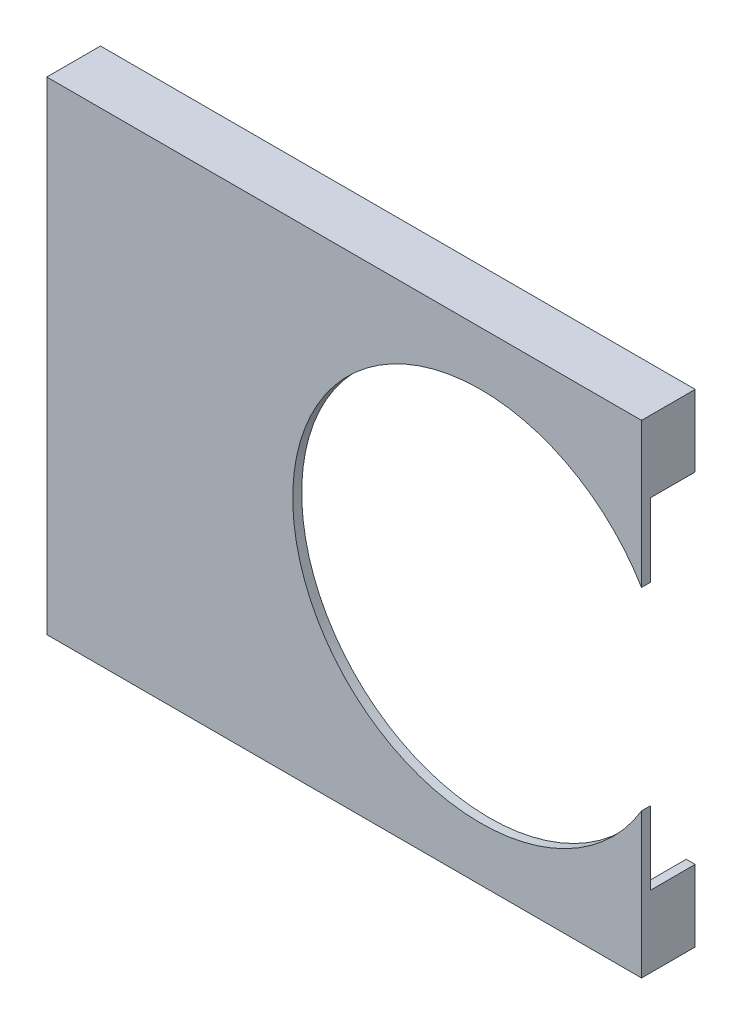
ISO-10303-21;
HEADER;
FILE_DESCRIPTION(('STEP AP214'),'2;1');
FILE_NAME('part.step','',(''),(''),'','','');
FILE_SCHEMA(('AUTOMOTIVE_DESIGN { 1 0 10303 214 1 1 1 1 }'));
ENDSEC;
DATA;
#1=APPLICATION_CONTEXT('core data for automotive mechanical design processes');
#2=APPLICATION_PROTOCOL_DEFINITION('international standard','automotive_design',2000,#1);
#3=PRODUCT_CONTEXT('',#1,'mechanical');
#4=PRODUCT('Part','Part','',(#3));
#5=PRODUCT_RELATED_PRODUCT_CATEGORY('part','',(#4));
#6=PRODUCT_DEFINITION_FORMATION('','',#4);
#7=PRODUCT_DEFINITION_CONTEXT('part definition',#1,'design');
#8=PRODUCT_DEFINITION('design','',#6,#7);
#9=PRODUCT_DEFINITION_SHAPE('','',#8);
#10=(LENGTH_UNIT() NAMED_UNIT(*) SI_UNIT(.MILLI.,.METRE.));
#11=(NAMED_UNIT(*) PLANE_ANGLE_UNIT() SI_UNIT($,.RADIAN.));
#12=(NAMED_UNIT(*) SI_UNIT($,.STERADIAN.) SOLID_ANGLE_UNIT());
#13=UNCERTAINTY_MEASURE_WITH_UNIT(LENGTH_MEASURE(1.E-05),#10,'distance_accuracy_value','');
#14=(GEOMETRIC_REPRESENTATION_CONTEXT(3) GLOBAL_UNCERTAINTY_ASSIGNED_CONTEXT((#13)) GLOBAL_UNIT_ASSIGNED_CONTEXT((#10,
#11,#12)) REPRESENTATION_CONTEXT('',''));
#15=CARTESIAN_POINT('',(0.,0.,0.));
#16=DIRECTION('',(0.,0.,1.));
#17=DIRECTION('',(1.,0.,0.));
#18=AXIS2_PLACEMENT_3D('',#15,#16,#17);
#19=CARTESIAN_POINT('',(15.25,0.,1.));
#20=DIRECTION('',(0.,0.,-1.));
#21=DIRECTION('',(-1.,0.,0.));
#22=AXIS2_PLACEMENT_3D('',#19,#20,#21);
#23=CYLINDRICAL_SURFACE('',#22,21.);
#24=CARTESIAN_POINT('',(15.25,0.,0.));
#25=DIRECTION('',(0.,0.,1.));
#26=DIRECTION('',(1.,0.,0.));
#27=AXIS2_PLACEMENT_3D('',#24,#25,#26);
#28=CIRCLE('',#27,21.);
#29=CARTESIAN_POINT('',(33.25,10.8166538263919,0.));
#30=VERTEX_POINT('',#29);
#31=CARTESIAN_POINT('',(33.25,-10.8166538263919,0.));
#32=VERTEX_POINT('',#31);
#33=EDGE_CURVE('E258',#30,#32,#28,.T.);
#34=ORIENTED_EDGE('',*,*,#33,.F.);
#35=DIRECTION('',(0.,0.,-1.));
#36=VECTOR('',#35,1.);
#37=CARTESIAN_POINT('',(33.25,10.8166538263919,1.));
#38=LINE('',#37,#36);
#39=CARTESIAN_POINT('',(33.25,10.8166538263919,1.));
#40=VERTEX_POINT('',#39);
#41=EDGE_CURVE('E12',#40,#30,#38,.T.);
#42=ORIENTED_EDGE('',*,*,#41,.F.);
#43=CARTESIAN_POINT('',(15.25,0.,1.));
#44=DIRECTION('',(0.,0.,1.));
#45=DIRECTION('',(1.,0.,0.));
#46=AXIS2_PLACEMENT_3D('',#43,#44,#45);
#47=CIRCLE('',#46,21.);
#48=CARTESIAN_POINT('',(33.25,-10.8166538263919,1.));
#49=VERTEX_POINT('',#48);
#50=EDGE_CURVE('E294',#40,#49,#47,.T.);
#51=ORIENTED_EDGE('',*,*,#50,.T.);
#52=DIRECTION('',(0.,0.,-1.));
#53=VECTOR('',#52,1.);
#54=CARTESIAN_POINT('',(33.25,-10.8166538263919,1.));
#55=LINE('',#54,#53);
#56=EDGE_CURVE('E314',#49,#32,#55,.T.);
#57=ORIENTED_EDGE('',*,*,#56,.T.);
#58=EDGE_LOOP('',(#34,#42,#51,#57));
#59=FACE_BOUND('',#58,.T.);
#60=ADVANCED_FACE('F59',(#59),#23,.F.);
#61=CARTESIAN_POINT('',(33.25,0.,1.));
#62=DIRECTION('',(1.,0.,0.));
#63=DIRECTION('',(0.,0.,-1.));
#64=AXIS2_PLACEMENT_3D('',#61,#62,#63);
#65=PLANE('',#64);
#66=DIRECTION('',(0.,-1.,0.));
#67=VECTOR('',#66,1.);
#68=CARTESIAN_POINT('',(33.25,0.,0.));
#69=LINE('',#68,#67);
#70=CARTESIAN_POINT('',(33.25,19.,0.));
#71=VERTEX_POINT('',#70);
#72=EDGE_CURVE('E189',#71,#30,#69,.T.);
#73=ORIENTED_EDGE('',*,*,#72,.F.);
#74=DIRECTION('',(0.,0.,1.));
#75=VECTOR('',#74,1.);
#76=CARTESIAN_POINT('',(33.25,19.,-5.));
#77=LINE('',#76,#75);
#78=CARTESIAN_POINT('',(33.25,19.,-5.));
#79=VERTEX_POINT('',#78);
#80=EDGE_CURVE('E183',#79,#71,#77,.T.);
#81=ORIENTED_EDGE('',*,*,#80,.F.);
#82=DIRECTION('',(0.,1.,0.));
#83=VECTOR('',#82,1.);
#84=CARTESIAN_POINT('',(33.25,0.,-5.));
#85=LINE('',#84,#83);
#86=CARTESIAN_POINT('',(33.25,27.,-5.));
#87=VERTEX_POINT('',#86);
#88=EDGE_CURVE('E187',#79,#87,#85,.T.);
#89=ORIENTED_EDGE('',*,*,#88,.T.);
#90=DIRECTION('',(0.,0.,-1.));
#91=VECTOR('',#90,1.);
#92=CARTESIAN_POINT('',(33.25,27.,1.));
#93=LINE('',#92,#91);
#94=CARTESIAN_POINT('',(33.25,27.,1.));
#95=VERTEX_POINT('',#94);
#96=EDGE_CURVE('E66',#95,#87,#93,.T.);
#97=ORIENTED_EDGE('',*,*,#96,.F.);
#98=DIRECTION('',(0.,-1.,0.));
#99=VECTOR('',#98,1.);
#100=CARTESIAN_POINT('',(33.25,0.,1.));
#101=LINE('',#100,#99);
#102=EDGE_CURVE('E297',#95,#40,#101,.T.);
#103=ORIENTED_EDGE('',*,*,#102,.T.);
#104=ORIENTED_EDGE('',*,*,#41,.T.);
#105=EDGE_LOOP('',(#73,#81,#89,#97,#103,#104));
#106=FACE_BOUND('',#105,.T.);
#107=ADVANCED_FACE('F185',(#106),#65,.T.);
#108=CARTESIAN_POINT('',(0.,27.,1.));
#109=DIRECTION('',(0.,1.,0.));
#110=DIRECTION('',(0.,0.,1.));
#111=AXIS2_PLACEMENT_3D('',#108,#109,#110);
#112=PLANE('',#111);
#113=ORIENTED_EDGE('',*,*,#96,.T.);
#114=DIRECTION('',(-1.,0.,0.));
#115=VECTOR('',#114,1.);
#116=CARTESIAN_POINT('',(0.,27.,-5.));
#117=LINE('',#116,#115);
#118=CARTESIAN_POINT('',(-33.25,27.,-5.));
#119=VERTEX_POINT('',#118);
#120=EDGE_CURVE('E207',#87,#119,#117,.T.);
#121=ORIENTED_EDGE('',*,*,#120,.T.);
#122=DIRECTION('',(0.,0.,-1.));
#123=VECTOR('',#122,1.);
#124=CARTESIAN_POINT('',(-33.25,27.,1.));
#125=LINE('',#124,#123);
#126=CARTESIAN_POINT('',(-33.25,27.,1.));
#127=VERTEX_POINT('',#126);
#128=EDGE_CURVE('E320',#127,#119,#125,.T.);
#129=ORIENTED_EDGE('',*,*,#128,.F.);
#130=DIRECTION('',(1.,0.,0.));
#131=VECTOR('',#130,1.);
#132=CARTESIAN_POINT('',(0.,27.,1.));
#133=LINE('',#132,#131);
#134=EDGE_CURVE('E301',#127,#95,#133,.T.);
#135=ORIENTED_EDGE('',*,*,#134,.T.);
#136=EDGE_LOOP('',(#113,#121,#129,#135));
#137=FACE_BOUND('',#136,.T.);
#138=ADVANCED_FACE('F322',(#137),#112,.T.);
#139=CARTESIAN_POINT('',(-33.25,0.,1.));
#140=DIRECTION('',(1.,0.,0.));
#141=DIRECTION('',(0.,0.,-1.));
#142=AXIS2_PLACEMENT_3D('',#139,#140,#141);
#143=PLANE('',#142);
#144=ORIENTED_EDGE('',*,*,#128,.T.);
#145=DIRECTION('',(0.,-1.,0.));
#146=VECTOR('',#145,1.);
#147=CARTESIAN_POINT('',(-33.25,0.,-5.));
#148=LINE('',#147,#146);
#149=CARTESIAN_POINT('',(-33.25,19.,-5.));
#150=VERTEX_POINT('',#149);
#151=EDGE_CURVE('E218',#119,#150,#148,.T.);
#152=ORIENTED_EDGE('',*,*,#151,.T.);
#153=DIRECTION('',(0.,0.,1.));
#154=VECTOR('',#153,1.);
#155=CARTESIAN_POINT('',(-33.25,19.,-5.));
#156=LINE('',#155,#154);
#157=CARTESIAN_POINT('',(-33.25,19.,0.));
#158=VERTEX_POINT('',#157);
#159=EDGE_CURVE('E222',#150,#158,#156,.T.);
#160=ORIENTED_EDGE('',*,*,#159,.T.);
#161=DIRECTION('',(0.,-1.,0.));
#162=VECTOR('',#161,1.);
#163=CARTESIAN_POINT('',(-33.25,0.,0.));
#164=LINE('',#163,#162);
#165=CARTESIAN_POINT('',(-33.25,-19.,0.));
#166=VERTEX_POINT('',#165);
#167=EDGE_CURVE('E312',#158,#166,#164,.T.);
#168=ORIENTED_EDGE('',*,*,#167,.T.);
#169=DIRECTION('',(0.,0.,1.));
#170=VECTOR('',#169,1.);
#171=CARTESIAN_POINT('',(-33.25,-19.,-5.));
#172=LINE('',#171,#170);
#173=CARTESIAN_POINT('',(-33.25,-19.,-5.));
#174=VERTEX_POINT('',#173);
#175=EDGE_CURVE('E259',#174,#166,#172,.T.);
#176=ORIENTED_EDGE('',*,*,#175,.F.);
#177=DIRECTION('',(0.,-1.,0.));
#178=VECTOR('',#177,1.);
#179=CARTESIAN_POINT('',(-33.25,0.,-5.));
#180=LINE('',#179,#178);
#181=CARTESIAN_POINT('',(-33.25,-27.,-5.));
#182=VERTEX_POINT('',#181);
#183=EDGE_CURVE('E246',#174,#182,#180,.T.);
#184=ORIENTED_EDGE('',*,*,#183,.T.);
#185=DIRECTION('',(0.,0.,-1.));
#186=VECTOR('',#185,1.);
#187=CARTESIAN_POINT('',(-33.25,-27.,1.));
#188=LINE('',#187,#186);
#189=CARTESIAN_POINT('',(-33.25,-27.,1.));
#190=VERTEX_POINT('',#189);
#191=EDGE_CURVE('E318',#190,#182,#188,.T.);
#192=ORIENTED_EDGE('',*,*,#191,.F.);
#193=DIRECTION('',(0.,-1.,0.));
#194=VECTOR('',#193,1.);
#195=CARTESIAN_POINT('',(-33.25,0.,1.));
#196=LINE('',#195,#194);
#197=EDGE_CURVE('E305',#127,#190,#196,.T.);
#198=ORIENTED_EDGE('',*,*,#197,.F.);
#199=EDGE_LOOP('',(#144,#152,#160,#168,#176,#184,#192,#198));
#200=FACE_BOUND('',#199,.T.);
#201=ADVANCED_FACE('F360',(#200),#143,.F.);
#202=CARTESIAN_POINT('',(0.,-27.,1.));
#203=DIRECTION('',(0.,1.,0.));
#204=DIRECTION('',(0.,0.,1.));
#205=AXIS2_PLACEMENT_3D('',#202,#203,#204);
#206=PLANE('',#205);
#207=ORIENTED_EDGE('',*,*,#191,.T.);
#208=DIRECTION('',(1.,0.,0.));
#209=VECTOR('',#208,1.);
#210=CARTESIAN_POINT('',(0.,-27.,-5.));
#211=LINE('',#210,#209);
#212=CARTESIAN_POINT('',(33.25,-27.,-5.));
#213=VERTEX_POINT('',#212);
#214=EDGE_CURVE('E287',#182,#213,#211,.T.);
#215=ORIENTED_EDGE('',*,*,#214,.T.);
#216=DIRECTION('',(0.,0.,-1.));
#217=VECTOR('',#216,1.);
#218=CARTESIAN_POINT('',(33.25,-27.,1.));
#219=LINE('',#218,#217);
#220=CARTESIAN_POINT('',(33.25,-27.,1.));
#221=VERTEX_POINT('',#220);
#222=EDGE_CURVE('E316',#221,#213,#219,.T.);
#223=ORIENTED_EDGE('',*,*,#222,.F.);
#224=DIRECTION('',(1.,0.,0.));
#225=VECTOR('',#224,1.);
#226=CARTESIAN_POINT('',(0.,-27.,1.));
#227=LINE('',#226,#225);
#228=EDGE_CURVE('E307',#190,#221,#227,.T.);
#229=ORIENTED_EDGE('',*,*,#228,.F.);
#230=EDGE_LOOP('',(#207,#215,#223,#229));
#231=FACE_BOUND('',#230,.T.);
#232=ADVANCED_FACE('F365',(#231),#206,.F.);
#233=CARTESIAN_POINT('',(33.25,-19.,0.));
#234=VERTEX_POINT('',#233);
#235=EDGE_CURVE('E298',#32,#234,#69,.T.);
#236=ORIENTED_EDGE('',*,*,#235,.F.);
#237=ORIENTED_EDGE('',*,*,#56,.F.);
#238=EDGE_CURVE('E302',#49,#221,#101,.T.);
#239=ORIENTED_EDGE('',*,*,#238,.T.);
#240=ORIENTED_EDGE('',*,*,#222,.T.);
#241=DIRECTION('',(0.,1.,0.));
#242=VECTOR('',#241,1.);
#243=CARTESIAN_POINT('',(33.25,0.,-5.));
#244=LINE('',#243,#242);
#245=CARTESIAN_POINT('',(33.25,-19.,-5.));
#246=VERTEX_POINT('',#245);
#247=EDGE_CURVE('E270',#213,#246,#244,.T.);
#248=ORIENTED_EDGE('',*,*,#247,.T.);
#249=DIRECTION('',(0.,0.,1.));
#250=VECTOR('',#249,1.);
#251=CARTESIAN_POINT('',(33.25,-19.,-5.));
#252=LINE('',#251,#250);
#253=EDGE_CURVE('E282',#246,#234,#252,.T.);
#254=ORIENTED_EDGE('',*,*,#253,.T.);
#255=EDGE_LOOP('',(#236,#237,#239,#240,#248,#254));
#256=FACE_BOUND('',#255,.T.);
#257=ADVANCED_FACE('F335',(#256),#65,.T.);
#258=CARTESIAN_POINT('',(0.,0.,1.));
#259=DIRECTION('',(0.,0.,1.));
#260=DIRECTION('',(1.,0.,0.));
#261=AXIS2_PLACEMENT_3D('',#258,#259,#260);
#262=PLANE('',#261);
#263=ORIENTED_EDGE('',*,*,#50,.F.);
#264=ORIENTED_EDGE('',*,*,#102,.F.);
#265=ORIENTED_EDGE('',*,*,#134,.F.);
#266=ORIENTED_EDGE('',*,*,#197,.T.);
#267=ORIENTED_EDGE('',*,*,#228,.T.);
#268=ORIENTED_EDGE('',*,*,#238,.F.);
#269=EDGE_LOOP('',(#263,#264,#265,#266,#267,#268));
#270=FACE_BOUND('',#269,.T.);
#271=ADVANCED_FACE('F327',(#270),#262,.T.);
#272=CARTESIAN_POINT('',(0.,0.,0.));
#273=DIRECTION('',(0.,0.,1.));
#274=DIRECTION('',(1.,0.,0.));
#275=AXIS2_PLACEMENT_3D('',#272,#273,#274);
#276=PLANE('',#275);
#277=ORIENTED_EDGE('',*,*,#167,.F.);
#278=DIRECTION('',(1.,0.,0.));
#279=VECTOR('',#278,1.);
#280=CARTESIAN_POINT('',(0.,19.,0.));
#281=LINE('',#280,#279);
#282=CARTESIAN_POINT('',(-32.25,19.,0.));
#283=VERTEX_POINT('',#282);
#284=EDGE_CURVE('E73',#158,#283,#281,.T.);
#285=ORIENTED_EDGE('',*,*,#284,.T.);
#286=DIRECTION('',(0.,1.,0.));
#287=VECTOR('',#286,1.);
#288=CARTESIAN_POINT('',(-32.25,0.,0.));
#289=LINE('',#288,#287);
#290=CARTESIAN_POINT('',(-32.25,26.,0.));
#291=VERTEX_POINT('',#290);
#292=EDGE_CURVE('E231',#283,#291,#289,.T.);
#293=ORIENTED_EDGE('',*,*,#292,.T.);
#294=DIRECTION('',(-1.,0.,0.));
#295=VECTOR('',#294,1.);
#296=CARTESIAN_POINT('',(0.,26.,0.));
#297=LINE('',#296,#295);
#298=CARTESIAN_POINT('',(32.25,26.,0.));
#299=VERTEX_POINT('',#298);
#300=EDGE_CURVE('E192',#299,#291,#297,.T.);
#301=ORIENTED_EDGE('',*,*,#300,.F.);
#302=DIRECTION('',(0.,1.,0.));
#303=VECTOR('',#302,1.);
#304=CARTESIAN_POINT('',(32.25,0.,0.));
#305=LINE('',#304,#303);
#306=CARTESIAN_POINT('',(32.25,19.,0.));
#307=VERTEX_POINT('',#306);
#308=EDGE_CURVE('E80',#307,#299,#305,.T.);
#309=ORIENTED_EDGE('',*,*,#308,.F.);
#310=DIRECTION('',(-1.,0.,0.));
#311=VECTOR('',#310,1.);
#312=CARTESIAN_POINT('',(0.,19.,0.));
#313=LINE('',#312,#311);
#314=EDGE_CURVE('E208',#71,#307,#313,.T.);
#315=ORIENTED_EDGE('',*,*,#314,.F.);
#316=ORIENTED_EDGE('',*,*,#72,.T.);
#317=ORIENTED_EDGE('',*,*,#33,.T.);
#318=ORIENTED_EDGE('',*,*,#235,.T.);
#319=DIRECTION('',(1.,0.,0.));
#320=VECTOR('',#319,1.);
#321=CARTESIAN_POINT('',(0.,-19.,0.));
#322=LINE('',#321,#320);
#323=CARTESIAN_POINT('',(32.25,-19.,0.));
#324=VERTEX_POINT('',#323);
#325=EDGE_CURVE('E268',#324,#234,#322,.T.);
#326=ORIENTED_EDGE('',*,*,#325,.F.);
#327=DIRECTION('',(0.,1.,0.));
#328=VECTOR('',#327,1.);
#329=CARTESIAN_POINT('',(32.25,0.,0.));
#330=LINE('',#329,#328);
#331=CARTESIAN_POINT('',(32.25,-26.,0.));
#332=VERTEX_POINT('',#331);
#333=EDGE_CURVE('E274',#332,#324,#330,.T.);
#334=ORIENTED_EDGE('',*,*,#333,.F.);
#335=DIRECTION('',(1.,0.,0.));
#336=VECTOR('',#335,1.);
#337=CARTESIAN_POINT('',(0.,-26.,0.));
#338=LINE('',#337,#336);
#339=CARTESIAN_POINT('',(-32.25,-26.,0.));
#340=VERTEX_POINT('',#339);
#341=EDGE_CURVE('E290',#340,#332,#338,.T.);
#342=ORIENTED_EDGE('',*,*,#341,.F.);
#343=DIRECTION('',(0.,1.,0.));
#344=VECTOR('',#343,1.);
#345=CARTESIAN_POINT('',(-32.25,0.,0.));
#346=LINE('',#345,#344);
#347=CARTESIAN_POINT('',(-32.25,-19.,0.));
#348=VERTEX_POINT('',#347);
#349=EDGE_CURVE('E250',#340,#348,#346,.T.);
#350=ORIENTED_EDGE('',*,*,#349,.T.);
#351=DIRECTION('',(-1.,0.,0.));
#352=VECTOR('',#351,1.);
#353=CARTESIAN_POINT('',(0.,-19.,0.));
#354=LINE('',#353,#352);
#355=EDGE_CURVE('E243',#348,#166,#354,.T.);
#356=ORIENTED_EDGE('',*,*,#355,.T.);
#357=EDGE_LOOP('',(#277,#285,#293,#301,#309,#315,#316,#317,#318,#326,#334,#342,#350,#356));
#358=FACE_BOUND('',#357,.T.);
#359=ADVANCED_FACE('F333',(#358),#276,.F.);
#360=CARTESIAN_POINT('',(0.,-19.,-5.));
#361=DIRECTION('',(0.,1.,0.));
#362=DIRECTION('',(0.,0.,1.));
#363=AXIS2_PLACEMENT_3D('',#360,#361,#362);
#364=PLANE('',#363);
#365=ORIENTED_EDGE('',*,*,#355,.F.);
#366=DIRECTION('',(0.,0.,1.));
#367=VECTOR('',#366,1.);
#368=CARTESIAN_POINT('',(-32.25,-19.,-5.));
#369=LINE('',#368,#367);
#370=CARTESIAN_POINT('',(-32.25,-19.,-5.));
#371=VERTEX_POINT('',#370);
#372=EDGE_CURVE('E249',#371,#348,#369,.T.);
#373=ORIENTED_EDGE('',*,*,#372,.F.);
#374=DIRECTION('',(-1.,0.,0.));
#375=VECTOR('',#374,1.);
#376=CARTESIAN_POINT('',(0.,-19.,-5.));
#377=LINE('',#376,#375);
#378=EDGE_CURVE('E242',#371,#174,#377,.T.);
#379=ORIENTED_EDGE('',*,*,#378,.T.);
#380=ORIENTED_EDGE('',*,*,#175,.T.);
#381=EDGE_LOOP('',(#365,#373,#379,#380));
#382=FACE_BOUND('',#381,.T.);
#383=ADVANCED_FACE('F358',(#382),#364,.T.);
#384=CARTESIAN_POINT('',(-32.25,0.,-5.));
#385=DIRECTION('',(1.,0.,0.));
#386=DIRECTION('',(0.,0.,-1.));
#387=AXIS2_PLACEMENT_3D('',#384,#385,#386);
#388=PLANE('',#387);
#389=ORIENTED_EDGE('',*,*,#349,.F.);
#390=DIRECTION('',(0.,0.,1.));
#391=VECTOR('',#390,1.);
#392=CARTESIAN_POINT('',(-32.25,-26.,-5.));
#393=LINE('',#392,#391);
#394=CARTESIAN_POINT('',(-32.25,-26.,-5.));
#395=VERTEX_POINT('',#394);
#396=EDGE_CURVE('E255',#395,#340,#393,.T.);
#397=ORIENTED_EDGE('',*,*,#396,.F.);
#398=DIRECTION('',(0.,1.,0.));
#399=VECTOR('',#398,1.);
#400=CARTESIAN_POINT('',(-32.25,0.,-5.));
#401=LINE('',#400,#399);
#402=EDGE_CURVE('E239',#395,#371,#401,.T.);
#403=ORIENTED_EDGE('',*,*,#402,.T.);
#404=ORIENTED_EDGE('',*,*,#372,.T.);
#405=EDGE_LOOP('',(#389,#397,#403,#404));
#406=FACE_BOUND('',#405,.T.);
#407=ADVANCED_FACE('F355',(#406),#388,.T.);
#408=CARTESIAN_POINT('',(0.,0.,-5.));
#409=DIRECTION('',(0.,0.,1.));
#410=DIRECTION('',(1.,0.,0.));
#411=AXIS2_PLACEMENT_3D('',#408,#409,#410);
#412=PLANE('',#411);
#413=ORIENTED_EDGE('',*,*,#402,.F.);
#414=DIRECTION('',(1.,0.,0.));
#415=VECTOR('',#414,1.);
#416=CARTESIAN_POINT('',(0.,-26.,-5.));
#417=LINE('',#416,#415);
#418=CARTESIAN_POINT('',(32.25,-26.,-5.));
#419=VERTEX_POINT('',#418);
#420=EDGE_CURVE('E277',#395,#419,#417,.T.);
#421=ORIENTED_EDGE('',*,*,#420,.T.);
#422=DIRECTION('',(0.,1.,0.));
#423=VECTOR('',#422,1.);
#424=CARTESIAN_POINT('',(32.25,0.,-5.));
#425=LINE('',#424,#423);
#426=CARTESIAN_POINT('',(32.25,-19.,-5.));
#427=VERTEX_POINT('',#426);
#428=EDGE_CURVE('E264',#419,#427,#425,.T.);
#429=ORIENTED_EDGE('',*,*,#428,.T.);
#430=DIRECTION('',(1.,0.,0.));
#431=VECTOR('',#430,1.);
#432=CARTESIAN_POINT('',(0.,-19.,-5.));
#433=LINE('',#432,#431);
#434=EDGE_CURVE('E267',#427,#246,#433,.T.);
#435=ORIENTED_EDGE('',*,*,#434,.T.);
#436=ORIENTED_EDGE('',*,*,#247,.F.);
#437=ORIENTED_EDGE('',*,*,#214,.F.);
#438=ORIENTED_EDGE('',*,*,#183,.F.);
#439=ORIENTED_EDGE('',*,*,#378,.F.);
#440=EDGE_LOOP('',(#413,#421,#429,#435,#436,#437,#438,#439));
#441=FACE_BOUND('',#440,.T.);
#442=ADVANCED_FACE('F351',(#441),#412,.F.);
#443=CARTESIAN_POINT('',(0.,-19.,-5.));
#444=DIRECTION('',(0.,-1.,0.));
#445=DIRECTION('',(0.,0.,-1.));
#446=AXIS2_PLACEMENT_3D('',#443,#444,#445);
#447=PLANE('',#446);
#448=ORIENTED_EDGE('',*,*,#325,.T.);
#449=ORIENTED_EDGE('',*,*,#253,.F.);
#450=ORIENTED_EDGE('',*,*,#434,.F.);
#451=DIRECTION('',(0.,0.,1.));
#452=VECTOR('',#451,1.);
#453=CARTESIAN_POINT('',(32.25,-19.,-5.));
#454=LINE('',#453,#452);
#455=EDGE_CURVE('E252',#427,#324,#454,.T.);
#456=ORIENTED_EDGE('',*,*,#455,.T.);
#457=EDGE_LOOP('',(#448,#449,#450,#456));
#458=FACE_BOUND('',#457,.T.);
#459=ADVANCED_FACE('F339',(#458),#447,.F.);
#460=CARTESIAN_POINT('',(32.25,0.,-5.));
#461=DIRECTION('',(1.,0.,0.));
#462=DIRECTION('',(0.,0.,-1.));
#463=AXIS2_PLACEMENT_3D('',#460,#461,#462);
#464=PLANE('',#463);
#465=ORIENTED_EDGE('',*,*,#333,.T.);
#466=ORIENTED_EDGE('',*,*,#455,.F.);
#467=ORIENTED_EDGE('',*,*,#428,.F.);
#468=DIRECTION('',(0.,0.,1.));
#469=VECTOR('',#468,1.);
#470=CARTESIAN_POINT('',(32.25,-26.,-5.));
#471=LINE('',#470,#469);
#472=EDGE_CURVE('E273',#419,#332,#471,.T.);
#473=ORIENTED_EDGE('',*,*,#472,.T.);
#474=EDGE_LOOP('',(#465,#466,#467,#473));
#475=FACE_BOUND('',#474,.T.);
#476=ADVANCED_FACE('F348',(#475),#464,.F.);
#477=CARTESIAN_POINT('',(0.,-26.,-5.));
#478=DIRECTION('',(0.,-1.,0.));
#479=DIRECTION('',(0.,0.,-1.));
#480=AXIS2_PLACEMENT_3D('',#477,#478,#479);
#481=PLANE('',#480);
#482=ORIENTED_EDGE('',*,*,#420,.F.);
#483=ORIENTED_EDGE('',*,*,#396,.T.);
#484=ORIENTED_EDGE('',*,*,#341,.T.);
#485=ORIENTED_EDGE('',*,*,#472,.F.);
#486=EDGE_LOOP('',(#482,#483,#484,#485));
#487=FACE_BOUND('',#486,.T.);
#488=ADVANCED_FACE('F345',(#487),#481,.F.);
#489=CARTESIAN_POINT('',(-32.25,0.,-5.));
#490=DIRECTION('',(1.,0.,0.));
#491=DIRECTION('',(0.,0.,-1.));
#492=AXIS2_PLACEMENT_3D('',#489,#490,#491);
#493=PLANE('',#492);
#494=ORIENTED_EDGE('',*,*,#292,.F.);
#495=DIRECTION('',(0.,0.,1.));
#496=VECTOR('',#495,1.);
#497=CARTESIAN_POINT('',(-32.25,19.,-5.));
#498=LINE('',#497,#496);
#499=CARTESIAN_POINT('',(-32.25,19.,-5.));
#500=VERTEX_POINT('',#499);
#501=EDGE_CURVE('E226',#500,#283,#498,.T.);
#502=ORIENTED_EDGE('',*,*,#501,.F.);
#503=DIRECTION('',(0.,1.,0.));
#504=VECTOR('',#503,1.);
#505=CARTESIAN_POINT('',(-32.25,0.,-5.));
#506=LINE('',#505,#504);
#507=CARTESIAN_POINT('',(-32.25,26.,-5.));
#508=VERTEX_POINT('',#507);
#509=EDGE_CURVE('E225',#500,#508,#506,.T.);
#510=ORIENTED_EDGE('',*,*,#509,.T.);
#511=DIRECTION('',(0.,0.,1.));
#512=VECTOR('',#511,1.);
#513=CARTESIAN_POINT('',(-32.25,26.,-5.));
#514=LINE('',#513,#512);
#515=EDGE_CURVE('E228',#508,#291,#514,.T.);
#516=ORIENTED_EDGE('',*,*,#515,.T.);
#517=EDGE_LOOP('',(#494,#502,#510,#516));
#518=FACE_BOUND('',#517,.T.);
#519=ADVANCED_FACE('F374',(#518),#493,.T.);
#520=CARTESIAN_POINT('',(0.,19.,-5.));
#521=DIRECTION('',(0.,-1.,0.));
#522=DIRECTION('',(0.,0.,-1.));
#523=AXIS2_PLACEMENT_3D('',#520,#521,#522);
#524=PLANE('',#523);
#525=ORIENTED_EDGE('',*,*,#284,.F.);
#526=ORIENTED_EDGE('',*,*,#159,.F.);
#527=DIRECTION('',(1.,0.,0.));
#528=VECTOR('',#527,1.);
#529=CARTESIAN_POINT('',(0.,19.,-5.));
#530=LINE('',#529,#528);
#531=EDGE_CURVE('E233',#150,#500,#530,.T.);
#532=ORIENTED_EDGE('',*,*,#531,.T.);
#533=ORIENTED_EDGE('',*,*,#501,.T.);
#534=EDGE_LOOP('',(#525,#526,#532,#533));
#535=FACE_BOUND('',#534,.T.);
#536=ADVANCED_FACE('F371',(#535),#524,.T.);
#537=CARTESIAN_POINT('',(0.,0.,-5.));
#538=DIRECTION('',(0.,0.,1.));
#539=DIRECTION('',(1.,0.,0.));
#540=AXIS2_PLACEMENT_3D('',#537,#538,#539);
#541=PLANE('',#540);
#542=ORIENTED_EDGE('',*,*,#531,.F.);
#543=ORIENTED_EDGE('',*,*,#151,.F.);
#544=ORIENTED_EDGE('',*,*,#120,.F.);
#545=ORIENTED_EDGE('',*,*,#88,.F.);
#546=DIRECTION('',(-1.,0.,0.));
#547=VECTOR('',#546,1.);
#548=CARTESIAN_POINT('',(0.,19.,-5.));
#549=LINE('',#548,#547);
#550=CARTESIAN_POINT('',(32.25,19.,-5.));
#551=VERTEX_POINT('',#550);
#552=EDGE_CURVE('E195',#79,#551,#549,.T.);
#553=ORIENTED_EDGE('',*,*,#552,.T.);
#554=DIRECTION('',(0.,1.,0.));
#555=VECTOR('',#554,1.);
#556=CARTESIAN_POINT('',(32.25,0.,-5.));
#557=LINE('',#556,#555);
#558=CARTESIAN_POINT('',(32.25,26.,-5.));
#559=VERTEX_POINT('',#558);
#560=EDGE_CURVE('E201',#551,#559,#557,.T.);
#561=ORIENTED_EDGE('',*,*,#560,.T.);
#562=DIRECTION('',(-1.,0.,0.));
#563=VECTOR('',#562,1.);
#564=CARTESIAN_POINT('',(0.,26.,-5.));
#565=LINE('',#564,#563);
#566=EDGE_CURVE('E215',#559,#508,#565,.T.);
#567=ORIENTED_EDGE('',*,*,#566,.T.);
#568=ORIENTED_EDGE('',*,*,#509,.F.);
#569=EDGE_LOOP('',(#542,#543,#544,#545,#553,#561,#567,#568));
#570=FACE_BOUND('',#569,.T.);
#571=ADVANCED_FACE('F204',(#570),#541,.F.);
#572=CARTESIAN_POINT('',(0.,19.,-5.));
#573=DIRECTION('',(0.,1.,0.));
#574=DIRECTION('',(0.,0.,1.));
#575=AXIS2_PLACEMENT_3D('',#572,#573,#574);
#576=PLANE('',#575);
#577=ORIENTED_EDGE('',*,*,#314,.T.);
#578=DIRECTION('',(0.,0.,1.));
#579=VECTOR('',#578,1.);
#580=CARTESIAN_POINT('',(32.25,19.,-5.));
#581=LINE('',#580,#579);
#582=EDGE_CURVE('E191',#551,#307,#581,.T.);
#583=ORIENTED_EDGE('',*,*,#582,.F.);
#584=ORIENTED_EDGE('',*,*,#552,.F.);
#585=ORIENTED_EDGE('',*,*,#80,.T.);
#586=EDGE_LOOP('',(#577,#583,#584,#585));
#587=FACE_BOUND('',#586,.T.);
#588=ADVANCED_FACE('F196',(#587),#576,.F.);
#589=CARTESIAN_POINT('',(32.25,0.,-5.));
#590=DIRECTION('',(1.,0.,0.));
#591=DIRECTION('',(0.,0.,-1.));
#592=AXIS2_PLACEMENT_3D('',#589,#590,#591);
#593=PLANE('',#592);
#594=ORIENTED_EDGE('',*,*,#308,.T.);
#595=DIRECTION('',(0.,0.,1.));
#596=VECTOR('',#595,1.);
#597=CARTESIAN_POINT('',(32.25,26.,-5.));
#598=LINE('',#597,#596);
#599=EDGE_CURVE('E219',#559,#299,#598,.T.);
#600=ORIENTED_EDGE('',*,*,#599,.F.);
#601=ORIENTED_EDGE('',*,*,#560,.F.);
#602=ORIENTED_EDGE('',*,*,#582,.T.);
#603=EDGE_LOOP('',(#594,#600,#601,#602));
#604=FACE_BOUND('',#603,.T.);
#605=ADVANCED_FACE('F381',(#604),#593,.F.);
#606=CARTESIAN_POINT('',(0.,26.,-5.));
#607=DIRECTION('',(0.,1.,0.));
#608=DIRECTION('',(-1.,0.,0.));
#609=AXIS2_PLACEMENT_3D('',#606,#607,#608);
#610=PLANE('',#609);
#611=ORIENTED_EDGE('',*,*,#515,.F.);
#612=ORIENTED_EDGE('',*,*,#566,.F.);
#613=ORIENTED_EDGE('',*,*,#599,.T.);
#614=ORIENTED_EDGE('',*,*,#300,.T.);
#615=EDGE_LOOP('',(#611,#612,#613,#614));
#616=FACE_BOUND('',#615,.T.);
#617=ADVANCED_FACE('F378',(#616),#610,.F.);
#618=CLOSED_SHELL('',(#60,#107,#138,#201,#232,#257,#271,#359,#383,#407,#442,#459,#476,#488,#519,
#536,#571,#588,#605,#617));
#619=MANIFOLD_SOLID_BREP('B2',#618);
#620=ADVANCED_BREP_SHAPE_REPRESENTATION('',(#18,#619),#14);
#621=SHAPE_DEFINITION_REPRESENTATION(#9,#620);
ENDSEC;
END-ISO-10303-21;
